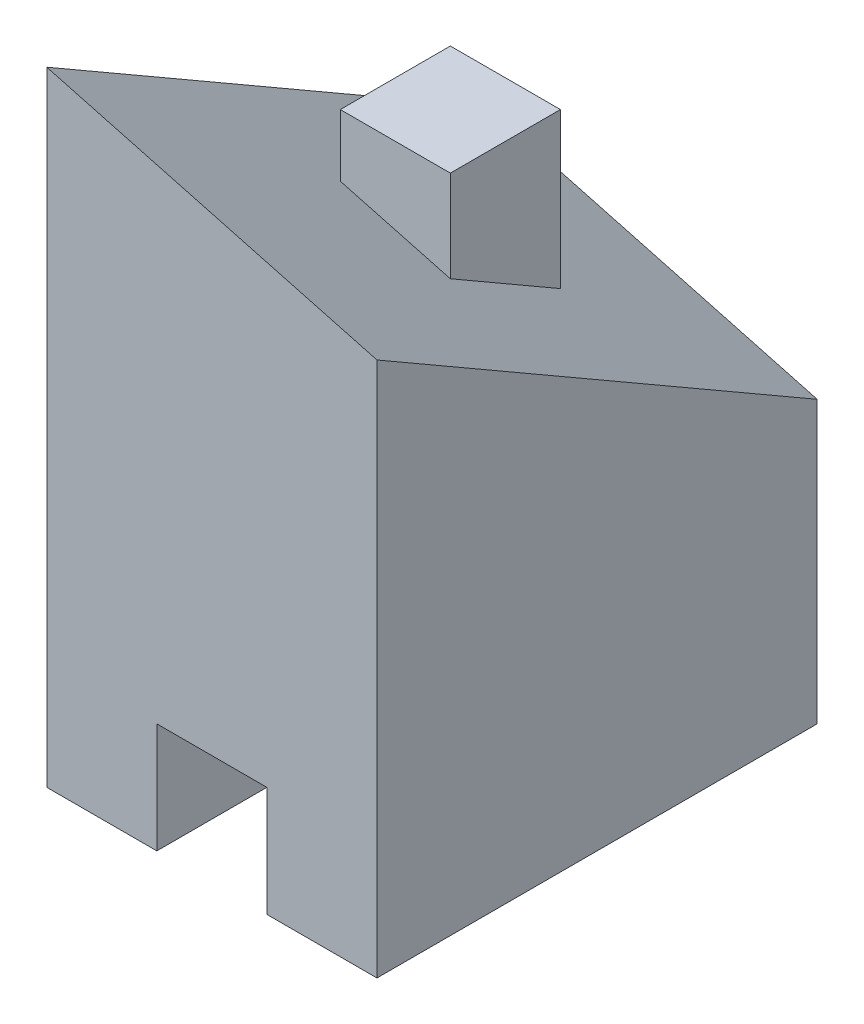
ISO-10303-21;
HEADER;
FILE_DESCRIPTION(('STEP AP214'),'2;1');
FILE_NAME('part.step','',(''),(''),'','','');
FILE_SCHEMA(('AUTOMOTIVE_DESIGN { 1 0 10303 214 1 1 1 1 }'));
ENDSEC;
DATA;
#1=APPLICATION_CONTEXT('core data for automotive mechanical design processes');
#2=APPLICATION_PROTOCOL_DEFINITION('international standard','automotive_design',2000,#1);
#3=PRODUCT_CONTEXT('',#1,'mechanical');
#4=PRODUCT('Part','Part','',(#3));
#5=PRODUCT_RELATED_PRODUCT_CATEGORY('part','',(#4));
#6=PRODUCT_DEFINITION_FORMATION('','',#4);
#7=PRODUCT_DEFINITION_CONTEXT('part definition',#1,'design');
#8=PRODUCT_DEFINITION('design','',#6,#7);
#9=PRODUCT_DEFINITION_SHAPE('','',#8);
#10=(LENGTH_UNIT() NAMED_UNIT(*) SI_UNIT(.MILLI.,.METRE.));
#11=(NAMED_UNIT(*) PLANE_ANGLE_UNIT() SI_UNIT($,.RADIAN.));
#12=(NAMED_UNIT(*) SI_UNIT($,.STERADIAN.) SOLID_ANGLE_UNIT());
#13=UNCERTAINTY_MEASURE_WITH_UNIT(LENGTH_MEASURE(1.E-05),#10,'distance_accuracy_value','');
#14=(GEOMETRIC_REPRESENTATION_CONTEXT(3) GLOBAL_UNCERTAINTY_ASSIGNED_CONTEXT((#13)) GLOBAL_UNIT_ASSIGNED_CONTEXT((#10,
#11,#12)) REPRESENTATION_CONTEXT('',''));
#15=CARTESIAN_POINT('',(0.,0.,0.));
#16=DIRECTION('',(0.,0.,1.));
#17=DIRECTION('',(1.,0.,0.));
#18=AXIS2_PLACEMENT_3D('',#15,#16,#17);
#19=CARTESIAN_POINT('',(45.,0.,0.));
#20=DIRECTION('',(0.,1.,0.));
#21=DIRECTION('',(0.,0.,1.));
#22=AXIS2_PLACEMENT_3D('',#19,#20,#21);
#23=PLANE('',#22);
#24=DIRECTION('',(-1.,0.,0.));
#25=VECTOR('',#24,1.);
#26=CARTESIAN_POINT('',(45.,0.,60.));
#27=LINE('',#26,#25);
#28=CARTESIAN_POINT('',(45.,0.,60.));
#29=VERTEX_POINT('',#28);
#30=CARTESIAN_POINT('',(30.,0.,60.));
#31=VERTEX_POINT('',#30);
#32=EDGE_CURVE('E155',#29,#31,#27,.T.);
#33=ORIENTED_EDGE('',*,*,#32,.T.);
#34=DIRECTION('',(0.,0.,-1.));
#35=VECTOR('',#34,1.);
#36=CARTESIAN_POINT('',(30.,0.,60.001));
#37=LINE('',#36,#35);
#38=CARTESIAN_POINT('',(30.,0.,0.));
#39=VERTEX_POINT('',#38);
#40=EDGE_CURVE('E139',#31,#39,#37,.T.);
#41=ORIENTED_EDGE('',*,*,#40,.T.);
#42=DIRECTION('',(-1.,0.,0.));
#43=VECTOR('',#42,1.);
#44=CARTESIAN_POINT('',(45.,0.,0.));
#45=LINE('',#44,#43);
#46=CARTESIAN_POINT('',(45.,0.,0.));
#47=VERTEX_POINT('',#46);
#48=EDGE_CURVE('E11',#47,#39,#45,.T.);
#49=ORIENTED_EDGE('',*,*,#48,.F.);
#50=DIRECTION('',(0.,0.,-1.));
#51=VECTOR('',#50,1.);
#52=CARTESIAN_POINT('',(45.,0.,0.));
#53=LINE('',#52,#51);
#54=EDGE_CURVE('E165',#29,#47,#53,.T.);
#55=ORIENTED_EDGE('',*,*,#54,.F.);
#56=EDGE_LOOP('',(#33,#41,#49,#55));
#57=FACE_BOUND('',#56,.T.);
#58=ADVANCED_FACE('F39',(#57),#23,.F.);
#59=CARTESIAN_POINT('',(9.60313142856001,35.8393744031474,-20.6918724592449));
#60=DIRECTION('',(-0.226044624379456,-0.843610022961951,0.487058473848149));
#61=DIRECTION('',(0.,-0.5,-0.866025403784439));
#62=AXIS2_PLACEMENT_3D('',#59,#60,#61);
#63=PLANE('',#62);
#64=DIRECTION('',(0.,-0.5,-0.866025403784439));
#65=VECTOR('',#64,1.);
#66=CARTESIAN_POINT('',(45.,28.7259526419164,-16.5849364905389));
#67=LINE('',#66,#65);
#68=CARTESIAN_POINT('',(45.,72.9422863405995,60.));
#69=VERTEX_POINT('',#68);
#70=CARTESIAN_POINT('',(45.,38.3012701892219,0.));
#71=VERTEX_POINT('',#70);
#72=EDGE_CURVE('E172',#69,#71,#67,.T.);
#73=ORIENTED_EDGE('',*,*,#72,.T.);
#74=DIRECTION('',(-0.965925826289068,0.258819045102521,0.));
#75=VECTOR('',#74,1.);
#76=CARTESIAN_POINT('',(12.5897459621556,46.9855715851499,0.));
#77=LINE('',#76,#75);
#78=CARTESIAN_POINT('',(0.,50.3589838486225,0.));
#79=VERTEX_POINT('',#78);
#80=EDGE_CURVE('E182',#71,#79,#77,.T.);
#81=ORIENTED_EDGE('',*,*,#80,.T.);
#82=DIRECTION('',(0.,-0.5,-0.866025403784439));
#83=VECTOR('',#82,1.);
#84=CARTESIAN_POINT('',(0.,37.7692378864668,-21.8060796608387));
#85=LINE('',#84,#83);
#86=CARTESIAN_POINT('',(0.,85.,60.));
#87=VERTEX_POINT('',#86);
#88=EDGE_CURVE('E188',#87,#79,#85,.T.);
#89=ORIENTED_EDGE('',*,*,#88,.F.);
#90=DIRECTION('',(0.965925826289068,-0.258819045102521,0.));
#91=VECTOR('',#90,1.);
#92=CARTESIAN_POINT('',(21.25,79.3060796608386,60.));
#93=LINE('',#92,#91);
#94=EDGE_CURVE('E185',#87,#69,#93,.T.);
#95=ORIENTED_EDGE('',*,*,#94,.T.);
#96=EDGE_LOOP('',(#73,#81,#89,#95));
#97=FACE_BOUND('',#96,.T.);
#98=DIRECTION('',(-0.965925826289068,0.258819045102521,0.));
#99=VECTOR('',#98,1.);
#100=CARTESIAN_POINT('',(29.4721878364871,54.0089403024499,20.));
#101=LINE('',#100,#99);
#102=CARTESIAN_POINT('',(30.,53.8675134594813,20.));
#103=VERTEX_POINT('',#102);
#104=CARTESIAN_POINT('',(15.,57.8867513459481,20.));
#105=VERTEX_POINT('',#104);
#106=EDGE_CURVE('E63',#103,#105,#101,.T.);
#107=ORIENTED_EDGE('',*,*,#106,.F.);
#108=DIRECTION('',(0.,-0.5,-0.866025403784439));
#109=VECTOR('',#108,1.);
#110=CARTESIAN_POINT('',(30.,46.8953256229943,7.92381642729072));
#111=LINE('',#110,#109);
#112=CARTESIAN_POINT('',(30.,62.5277674973257,35.));
#113=VERTEX_POINT('',#112);
#114=EDGE_CURVE('E200',#113,#103,#111,.T.);
#115=ORIENTED_EDGE('',*,*,#114,.F.);
#116=DIRECTION('',(0.965925826289068,-0.258819045102521,0.));
#117=VECTOR('',#116,1.);
#118=CARTESIAN_POINT('',(31.6372513459482,62.0890673213721,35.));
#119=LINE('',#118,#117);
#120=CARTESIAN_POINT('',(15.,66.5470053837925,35.));
#121=VERTEX_POINT('',#120);
#122=EDGE_CURVE('E196',#121,#113,#119,.T.);
#123=ORIENTED_EDGE('',*,*,#122,.F.);
#124=DIRECTION('',(0.,0.5,0.866025403784439));
#125=VECTOR('',#124,1.);
#126=CARTESIAN_POINT('',(15.,49.9097540378444,6.18343537052414));
#127=LINE('',#126,#125);
#128=EDGE_CURVE('E192',#105,#121,#127,.T.);
#129=ORIENTED_EDGE('',*,*,#128,.F.);
#130=EDGE_LOOP('',(#107,#115,#123,#129));
#131=FACE_BOUND('',#130,.T.);
#132=ADVANCED_FACE('F287',(#97,#131),#63,.F.);
#133=CARTESIAN_POINT('',(15.,0.,0.));
#134=VERTEX_POINT('',#133);
#135=CARTESIAN_POINT('',(0.,0.,0.));
#136=VERTEX_POINT('',#135);
#137=EDGE_CURVE('E48',#134,#136,#45,.T.);
#138=ORIENTED_EDGE('',*,*,#137,.F.);
#139=DIRECTION('',(0.,0.,-1.));
#140=VECTOR('',#139,1.);
#141=CARTESIAN_POINT('',(15.,0.,60.001));
#142=LINE('',#141,#140);
#143=CARTESIAN_POINT('',(15.,0.,60.));
#144=VERTEX_POINT('',#143);
#145=EDGE_CURVE('E132',#144,#134,#142,.T.);
#146=ORIENTED_EDGE('',*,*,#145,.F.);
#147=CARTESIAN_POINT('',(0.,0.,60.));
#148=VERTEX_POINT('',#147);
#149=EDGE_CURVE('E144',#144,#148,#27,.T.);
#150=ORIENTED_EDGE('',*,*,#149,.T.);
#151=DIRECTION('',(0.,0.,-1.));
#152=VECTOR('',#151,1.);
#153=CARTESIAN_POINT('',(0.,0.,0.));
#154=LINE('',#153,#152);
#155=EDGE_CURVE('E170',#148,#136,#154,.T.);
#156=ORIENTED_EDGE('',*,*,#155,.T.);
#157=EDGE_LOOP('',(#138,#146,#150,#156));
#158=FACE_BOUND('',#157,.T.);
#159=ADVANCED_FACE('F41',(#158),#23,.F.);
#160=CARTESIAN_POINT('',(45.,85.,0.));
#161=DIRECTION('',(0.,0.,1.));
#162=DIRECTION('',(1.,0.,0.));
#163=AXIS2_PLACEMENT_3D('',#160,#161,#162);
#164=PLANE('',#163);
#165=ORIENTED_EDGE('',*,*,#48,.T.);
#166=DIRECTION('',(0.,-1.,0.));
#167=VECTOR('',#166,1.);
#168=CARTESIAN_POINT('',(30.,0.,0.));
#169=LINE('',#168,#167);
#170=CARTESIAN_POINT('',(30.,15.,0.));
#171=VERTEX_POINT('',#170);
#172=EDGE_CURVE('E147',#171,#39,#169,.T.);
#173=ORIENTED_EDGE('',*,*,#172,.F.);
#174=DIRECTION('',(1.,0.,0.));
#175=VECTOR('',#174,1.);
#176=CARTESIAN_POINT('',(30.,15.,0.));
#177=LINE('',#176,#175);
#178=CARTESIAN_POINT('',(15.,15.,0.));
#179=VERTEX_POINT('',#178);
#180=EDGE_CURVE('E242',#179,#171,#177,.T.);
#181=ORIENTED_EDGE('',*,*,#180,.F.);
#182=DIRECTION('',(0.,1.,0.));
#183=VECTOR('',#182,1.);
#184=CARTESIAN_POINT('',(15.,15.,0.));
#185=LINE('',#184,#183);
#186=EDGE_CURVE('E246',#134,#179,#185,.T.);
#187=ORIENTED_EDGE('',*,*,#186,.F.);
#188=ORIENTED_EDGE('',*,*,#137,.T.);
#189=DIRECTION('',(0.,1.,0.));
#190=VECTOR('',#189,1.);
#191=CARTESIAN_POINT('',(0.,85.,0.));
#192=LINE('',#191,#190);
#193=EDGE_CURVE('E166',#136,#79,#192,.T.);
#194=ORIENTED_EDGE('',*,*,#193,.T.);
#195=ORIENTED_EDGE('',*,*,#80,.F.);
#196=DIRECTION('',(0.,1.,0.));
#197=VECTOR('',#196,1.);
#198=CARTESIAN_POINT('',(45.,85.,0.));
#199=LINE('',#198,#197);
#200=EDGE_CURVE('E160',#47,#71,#199,.T.);
#201=ORIENTED_EDGE('',*,*,#200,.F.);
#202=EDGE_LOOP('',(#165,#173,#181,#187,#188,#194,#195,#201));
#203=FACE_BOUND('',#202,.T.);
#204=ADVANCED_FACE('F271',(#203),#164,.F.);
#205=CARTESIAN_POINT('',(45.,0.,60.));
#206=DIRECTION('',(0.,0.,-1.));
#207=DIRECTION('',(-1.,0.,0.));
#208=AXIS2_PLACEMENT_3D('',#205,#206,#207);
#209=PLANE('',#208);
#210=DIRECTION('',(-1.,0.,0.));
#211=VECTOR('',#210,1.);
#212=CARTESIAN_POINT('',(30.,15.,60.));
#213=LINE('',#212,#211);
#214=CARTESIAN_POINT('',(30.,15.,60.));
#215=VERTEX_POINT('',#214);
#216=CARTESIAN_POINT('',(15.,15.,60.));
#217=VERTEX_POINT('',#216);
#218=EDGE_CURVE('E55',#215,#217,#213,.T.);
#219=ORIENTED_EDGE('',*,*,#218,.F.);
#220=DIRECTION('',(0.,1.,0.));
#221=VECTOR('',#220,1.);
#222=CARTESIAN_POINT('',(30.,0.,60.));
#223=LINE('',#222,#221);
#224=EDGE_CURVE('E249',#31,#215,#223,.T.);
#225=ORIENTED_EDGE('',*,*,#224,.F.);
#226=ORIENTED_EDGE('',*,*,#32,.F.);
#227=DIRECTION('',(0.,-1.,0.));
#228=VECTOR('',#227,1.);
#229=CARTESIAN_POINT('',(45.,0.,60.));
#230=LINE('',#229,#228);
#231=EDGE_CURVE('E156',#69,#29,#230,.T.);
#232=ORIENTED_EDGE('',*,*,#231,.F.);
#233=ORIENTED_EDGE('',*,*,#94,.F.);
#234=DIRECTION('',(0.,-1.,0.));
#235=VECTOR('',#234,1.);
#236=CARTESIAN_POINT('',(0.,0.,60.));
#237=LINE('',#236,#235);
#238=EDGE_CURVE('E152',#87,#148,#237,.T.);
#239=ORIENTED_EDGE('',*,*,#238,.T.);
#240=ORIENTED_EDGE('',*,*,#149,.F.);
#241=DIRECTION('',(0.,-1.,0.));
#242=VECTOR('',#241,1.);
#243=CARTESIAN_POINT('',(15.,15.,60.));
#244=LINE('',#243,#242);
#245=EDGE_CURVE('E128',#217,#144,#244,.T.);
#246=ORIENTED_EDGE('',*,*,#245,.F.);
#247=EDGE_LOOP('',(#219,#225,#226,#232,#233,#239,#240,#246));
#248=FACE_BOUND('',#247,.T.);
#249=ADVANCED_FACE('F149',(#248),#209,.F.);
#250=CARTESIAN_POINT('',(45.,0.,0.));
#251=DIRECTION('',(-1.,0.,0.));
#252=DIRECTION('',(0.,0.,1.));
#253=AXIS2_PLACEMENT_3D('',#250,#251,#252);
#254=PLANE('',#253);
#255=ORIENTED_EDGE('',*,*,#200,.T.);
#256=ORIENTED_EDGE('',*,*,#72,.F.);
#257=ORIENTED_EDGE('',*,*,#231,.T.);
#258=ORIENTED_EDGE('',*,*,#54,.T.);
#259=EDGE_LOOP('',(#255,#256,#257,#258));
#260=FACE_BOUND('',#259,.T.);
#261=ADVANCED_FACE('F263',(#260),#254,.F.);
#262=CARTESIAN_POINT('',(0.,0.,0.));
#263=DIRECTION('',(-1.,0.,0.));
#264=DIRECTION('',(0.,0.,1.));
#265=AXIS2_PLACEMENT_3D('',#262,#263,#264);
#266=PLANE('',#265);
#267=ORIENTED_EDGE('',*,*,#88,.T.);
#268=ORIENTED_EDGE('',*,*,#193,.F.);
#269=ORIENTED_EDGE('',*,*,#155,.F.);
#270=ORIENTED_EDGE('',*,*,#238,.F.);
#271=EDGE_LOOP('',(#267,#268,#269,#270));
#272=FACE_BOUND('',#271,.T.);
#273=ADVANCED_FACE('F267',(#272),#266,.T.);
#274=CARTESIAN_POINT('',(15.,-0.002000000000002,35.));
#275=DIRECTION('',(0.,0.,1.));
#276=DIRECTION('',(1.,0.,0.));
#277=AXIS2_PLACEMENT_3D('',#274,#275,#276);
#278=PLANE('',#277);
#279=DIRECTION('',(0.,1.,0.));
#280=VECTOR('',#279,1.);
#281=CARTESIAN_POINT('',(15.,-0.002000000000002,35.));
#282=LINE('',#281,#280);
#283=CARTESIAN_POINT('',(15.,75.,35.));
#284=VERTEX_POINT('',#283);
#285=EDGE_CURVE('E205',#121,#284,#282,.T.);
#286=ORIENTED_EDGE('',*,*,#285,.F.);
#287=ORIENTED_EDGE('',*,*,#122,.T.);
#288=DIRECTION('',(0.,1.,0.));
#289=VECTOR('',#288,1.);
#290=CARTESIAN_POINT('',(30.,-0.002000000000002,35.));
#291=LINE('',#290,#289);
#292=CARTESIAN_POINT('',(30.,75.,35.));
#293=VERTEX_POINT('',#292);
#294=EDGE_CURVE('E208',#113,#293,#291,.T.);
#295=ORIENTED_EDGE('',*,*,#294,.T.);
#296=DIRECTION('',(1.,0.,0.));
#297=VECTOR('',#296,1.);
#298=CARTESIAN_POINT('',(15.,75.,35.));
#299=LINE('',#298,#297);
#300=EDGE_CURVE('E217',#284,#293,#299,.T.);
#301=ORIENTED_EDGE('',*,*,#300,.F.);
#302=EDGE_LOOP('',(#286,#287,#295,#301));
#303=FACE_BOUND('',#302,.T.);
#304=ADVANCED_FACE('F285',(#303),#278,.T.);
#305=CARTESIAN_POINT('',(0.,75.,0.));
#306=DIRECTION('',(0.,-1.,0.));
#307=DIRECTION('',(0.,0.,-1.));
#308=AXIS2_PLACEMENT_3D('',#305,#306,#307);
#309=PLANE('',#308);
#310=DIRECTION('',(0.,0.,1.));
#311=VECTOR('',#310,1.);
#312=CARTESIAN_POINT('',(15.,75.,35.));
#313=LINE('',#312,#311);
#314=CARTESIAN_POINT('',(15.,75.,20.));
#315=VERTEX_POINT('',#314);
#316=EDGE_CURVE('E138',#315,#284,#313,.T.);
#317=ORIENTED_EDGE('',*,*,#316,.T.);
#318=ORIENTED_EDGE('',*,*,#300,.T.);
#319=DIRECTION('',(0.,0.,-1.));
#320=VECTOR('',#319,1.);
#321=CARTESIAN_POINT('',(30.,75.,35.));
#322=LINE('',#321,#320);
#323=CARTESIAN_POINT('',(30.,75.,20.));
#324=VERTEX_POINT('',#323);
#325=EDGE_CURVE('E225',#293,#324,#322,.T.);
#326=ORIENTED_EDGE('',*,*,#325,.T.);
#327=DIRECTION('',(-1.,0.,0.));
#328=VECTOR('',#327,1.);
#329=CARTESIAN_POINT('',(15.,75.,20.));
#330=LINE('',#329,#328);
#331=EDGE_CURVE('E221',#324,#315,#330,.T.);
#332=ORIENTED_EDGE('',*,*,#331,.T.);
#333=EDGE_LOOP('',(#317,#318,#326,#332));
#334=FACE_BOUND('',#333,.T.);
#335=ADVANCED_FACE('F309',(#334),#309,.F.);
#336=CARTESIAN_POINT('',(15.,-0.002000000000002,35.));
#337=DIRECTION('',(-1.,0.,0.));
#338=DIRECTION('',(0.,0.,1.));
#339=AXIS2_PLACEMENT_3D('',#336,#337,#338);
#340=PLANE('',#339);
#341=DIRECTION('',(0.,1.,0.));
#342=VECTOR('',#341,1.);
#343=CARTESIAN_POINT('',(15.,-0.002000000000002,20.));
#344=LINE('',#343,#342);
#345=EDGE_CURVE('E214',#105,#315,#344,.T.);
#346=ORIENTED_EDGE('',*,*,#345,.F.);
#347=ORIENTED_EDGE('',*,*,#128,.T.);
#348=ORIENTED_EDGE('',*,*,#285,.T.);
#349=ORIENTED_EDGE('',*,*,#316,.F.);
#350=EDGE_LOOP('',(#346,#347,#348,#349));
#351=FACE_BOUND('',#350,.T.);
#352=ADVANCED_FACE('F305',(#351),#340,.T.);
#353=CARTESIAN_POINT('',(30.,-0.002000000000002,35.));
#354=DIRECTION('',(1.,0.,0.));
#355=DIRECTION('',(0.,0.,-1.));
#356=AXIS2_PLACEMENT_3D('',#353,#354,#355);
#357=PLANE('',#356);
#358=ORIENTED_EDGE('',*,*,#294,.F.);
#359=ORIENTED_EDGE('',*,*,#114,.T.);
#360=DIRECTION('',(0.,1.,0.));
#361=VECTOR('',#360,1.);
#362=CARTESIAN_POINT('',(30.,-0.002000000000002,20.));
#363=LINE('',#362,#361);
#364=EDGE_CURVE('E211',#103,#324,#363,.T.);
#365=ORIENTED_EDGE('',*,*,#364,.T.);
#366=ORIENTED_EDGE('',*,*,#325,.F.);
#367=EDGE_LOOP('',(#358,#359,#365,#366));
#368=FACE_BOUND('',#367,.T.);
#369=ADVANCED_FACE('F308',(#368),#357,.T.);
#370=CARTESIAN_POINT('',(15.,-0.002000000000002,20.));
#371=DIRECTION('',(0.,0.,-1.));
#372=DIRECTION('',(-1.,0.,0.));
#373=AXIS2_PLACEMENT_3D('',#370,#371,#372);
#374=PLANE('',#373);
#375=ORIENTED_EDGE('',*,*,#364,.F.);
#376=ORIENTED_EDGE('',*,*,#106,.T.);
#377=ORIENTED_EDGE('',*,*,#345,.T.);
#378=ORIENTED_EDGE('',*,*,#331,.F.);
#379=EDGE_LOOP('',(#375,#376,#377,#378));
#380=FACE_BOUND('',#379,.T.);
#381=ADVANCED_FACE('F283',(#380),#374,.T.);
#382=CARTESIAN_POINT('',(30.,0.,60.001));
#383=DIRECTION('',(1.,0.,0.));
#384=DIRECTION('',(0.,0.,-1.));
#385=AXIS2_PLACEMENT_3D('',#382,#383,#384);
#386=PLANE('',#385);
#387=ORIENTED_EDGE('',*,*,#224,.T.);
#388=DIRECTION('',(0.,0.,-1.));
#389=VECTOR('',#388,1.);
#390=CARTESIAN_POINT('',(30.,15.,60.001));
#391=LINE('',#390,#389);
#392=EDGE_CURVE('E234',#215,#171,#391,.T.);
#393=ORIENTED_EDGE('',*,*,#392,.T.);
#394=ORIENTED_EDGE('',*,*,#172,.T.);
#395=ORIENTED_EDGE('',*,*,#40,.F.);
#396=EDGE_LOOP('',(#387,#393,#394,#395));
#397=FACE_BOUND('',#396,.T.);
#398=ADVANCED_FACE('F256',(#397),#386,.F.);
#399=CARTESIAN_POINT('',(30.,15.,60.001));
#400=DIRECTION('',(0.,1.,0.));
#401=DIRECTION('',(0.,0.,1.));
#402=AXIS2_PLACEMENT_3D('',#399,#400,#401);
#403=PLANE('',#402);
#404=ORIENTED_EDGE('',*,*,#218,.T.);
#405=DIRECTION('',(0.,0.,-1.));
#406=VECTOR('',#405,1.);
#407=CARTESIAN_POINT('',(15.,15.,60.001));
#408=LINE('',#407,#406);
#409=EDGE_CURVE('E134',#217,#179,#408,.T.);
#410=ORIENTED_EDGE('',*,*,#409,.T.);
#411=ORIENTED_EDGE('',*,*,#180,.T.);
#412=ORIENTED_EDGE('',*,*,#392,.F.);
#413=EDGE_LOOP('',(#404,#410,#411,#412));
#414=FACE_BOUND('',#413,.T.);
#415=ADVANCED_FACE('F275',(#414),#403,.F.);
#416=CARTESIAN_POINT('',(15.,15.,60.001));
#417=DIRECTION('',(-1.,0.,0.));
#418=DIRECTION('',(0.,-1.,0.));
#419=AXIS2_PLACEMENT_3D('',#416,#417,#418);
#420=PLANE('',#419);
#421=ORIENTED_EDGE('',*,*,#245,.T.);
#422=ORIENTED_EDGE('',*,*,#145,.T.);
#423=ORIENTED_EDGE('',*,*,#186,.T.);
#424=ORIENTED_EDGE('',*,*,#409,.F.);
#425=EDGE_LOOP('',(#421,#422,#423,#424));
#426=FACE_BOUND('',#425,.T.);
#427=ADVANCED_FACE('F130',(#426),#420,.F.);
#428=CLOSED_SHELL('',(#58,#132,#159,#204,#249,#261,#273,#304,#335,#352,#369,#381,#398,#415,#427));
#429=MANIFOLD_SOLID_BREP('B2',#428);
#430=ADVANCED_BREP_SHAPE_REPRESENTATION('',(#18,#429),#14);
#431=SHAPE_DEFINITION_REPRESENTATION(#9,#430);
ENDSEC;
END-ISO-10303-21;
